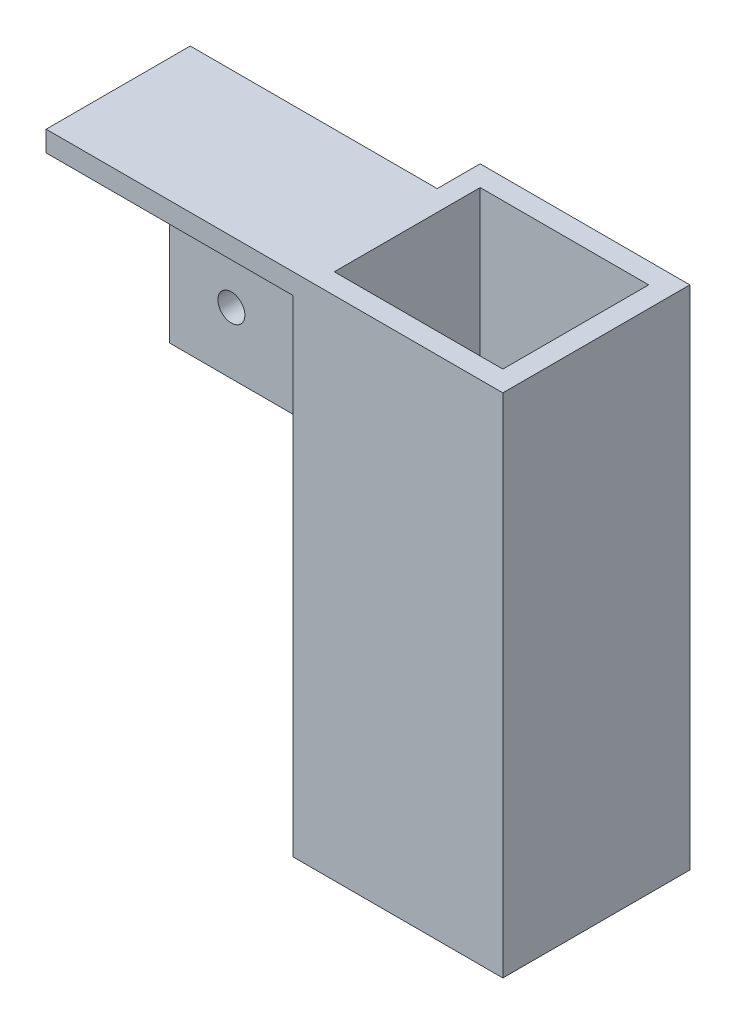
ISO-10303-21;
HEADER;
FILE_DESCRIPTION(('STEP AP214'),'2;1');
FILE_NAME('part.step','',(''),(''),'','','');
FILE_SCHEMA(('AUTOMOTIVE_DESIGN { 1 0 10303 214 1 1 1 1 }'));
ENDSEC;
DATA;
#1=APPLICATION_CONTEXT('core data for automotive mechanical design processes');
#2=APPLICATION_PROTOCOL_DEFINITION('international standard','automotive_design',2000,#1);
#3=PRODUCT_CONTEXT('',#1,'mechanical');
#4=PRODUCT('Part','Part','',(#3));
#5=PRODUCT_RELATED_PRODUCT_CATEGORY('part','',(#4));
#6=PRODUCT_DEFINITION_FORMATION('','',#4);
#7=PRODUCT_DEFINITION_CONTEXT('part definition',#1,'design');
#8=PRODUCT_DEFINITION('design','',#6,#7);
#9=PRODUCT_DEFINITION_SHAPE('','',#8);
#10=(LENGTH_UNIT() NAMED_UNIT(*) SI_UNIT(.MILLI.,.METRE.));
#11=(NAMED_UNIT(*) PLANE_ANGLE_UNIT() SI_UNIT($,.RADIAN.));
#12=(NAMED_UNIT(*) SI_UNIT($,.STERADIAN.) SOLID_ANGLE_UNIT());
#13=UNCERTAINTY_MEASURE_WITH_UNIT(LENGTH_MEASURE(1.E-05),#10,'distance_accuracy_value','');
#14=(GEOMETRIC_REPRESENTATION_CONTEXT(3) GLOBAL_UNCERTAINTY_ASSIGNED_CONTEXT((#13)) GLOBAL_UNIT_ASSIGNED_CONTEXT((#10,
#11,#12)) REPRESENTATION_CONTEXT('',''));
#15=CARTESIAN_POINT('',(0.,0.,0.));
#16=DIRECTION('',(0.,0.,1.));
#17=DIRECTION('',(1.,0.,0.));
#18=AXIS2_PLACEMENT_3D('',#15,#16,#17);
#19=CARTESIAN_POINT('',(-38.1,6.35,-19.05));
#20=DIRECTION('',(1.,0.,0.));
#21=DIRECTION('',(0.,0.,-1.));
#22=AXIS2_PLACEMENT_3D('',#19,#20,#21);
#23=PLANE('',#22);
#24=DIRECTION('',(0.,0.,1.));
#25=VECTOR('',#24,1.);
#26=CARTESIAN_POINT('',(-38.1,0.,-19.05));
#27=LINE('',#26,#25);
#28=CARTESIAN_POINT('',(-38.1,0.,-19.05));
#29=VERTEX_POINT('',#28);
#30=CARTESIAN_POINT('',(-38.1,0.,19.05));
#31=VERTEX_POINT('',#30);
#32=EDGE_CURVE('E259',#29,#31,#27,.T.);
#33=ORIENTED_EDGE('',*,*,#32,.T.);
#34=DIRECTION('',(0.,-1.,0.));
#35=VECTOR('',#34,1.);
#36=CARTESIAN_POINT('',(-38.1,6.35,19.05));
#37=LINE('',#36,#35);
#38=CARTESIAN_POINT('',(-38.1,6.35,19.05));
#39=VERTEX_POINT('',#38);
#40=EDGE_CURVE('E11',#39,#31,#37,.T.);
#41=ORIENTED_EDGE('',*,*,#40,.F.);
#42=DIRECTION('',(0.,0.,1.));
#43=VECTOR('',#42,1.);
#44=CARTESIAN_POINT('',(-38.1,6.35,-19.05));
#45=LINE('',#44,#43);
#46=CARTESIAN_POINT('',(-38.1,6.35,-25.4));
#47=VERTEX_POINT('',#46);
#48=EDGE_CURVE('E53',#47,#39,#45,.T.);
#49=ORIENTED_EDGE('',*,*,#48,.F.);
#50=DIRECTION('',(0.,1.,0.));
#51=VECTOR('',#50,1.);
#52=CARTESIAN_POINT('',(-38.1,6.35,-25.4));
#53=LINE('',#52,#51);
#54=CARTESIAN_POINT('',(-38.1,-69.85,-25.4));
#55=VERTEX_POINT('',#54);
#56=EDGE_CURVE('E229',#55,#47,#53,.T.);
#57=ORIENTED_EDGE('',*,*,#56,.F.);
#58=DIRECTION('',(0.,0.,1.));
#59=VECTOR('',#58,1.);
#60=CARTESIAN_POINT('',(-38.1,-69.85,-25.4));
#61=LINE('',#60,#59);
#62=CARTESIAN_POINT('',(-38.1,-69.85,-19.05));
#63=VERTEX_POINT('',#62);
#64=EDGE_CURVE('E241',#55,#63,#61,.T.);
#65=ORIENTED_EDGE('',*,*,#64,.T.);
#66=DIRECTION('',(0.,1.,0.));
#67=VECTOR('',#66,1.);
#68=CARTESIAN_POINT('',(-38.1,6.35,-19.05));
#69=LINE('',#68,#67);
#70=EDGE_CURVE('E226',#63,#29,#69,.T.);
#71=ORIENTED_EDGE('',*,*,#70,.T.);
#72=EDGE_LOOP('',(#33,#41,#49,#57,#65,#71));
#73=FACE_BOUND('',#72,.T.);
#74=ADVANCED_FACE('F39',(#73),#23,.F.);
#75=CARTESIAN_POINT('',(-38.1,6.35,19.05));
#76=DIRECTION('',(0.,0.,-1.));
#77=DIRECTION('',(-1.,0.,0.));
#78=AXIS2_PLACEMENT_3D('',#75,#76,#77);
#79=PLANE('',#78);
#80=DIRECTION('',(1.,0.,0.));
#81=VECTOR('',#80,1.);
#82=CARTESIAN_POINT('',(-38.1,0.,19.05));
#83=LINE('',#82,#81);
#84=CARTESIAN_POINT('',(38.1,0.,19.05));
#85=VERTEX_POINT('',#84);
#86=EDGE_CURVE('E136',#31,#85,#83,.T.);
#87=ORIENTED_EDGE('',*,*,#86,.T.);
#88=DIRECTION('',(0.,1.,0.));
#89=VECTOR('',#88,1.);
#90=CARTESIAN_POINT('',(38.1,-143.65,19.05));
#91=LINE('',#90,#89);
#92=CARTESIAN_POINT('',(38.1,-150.,19.05));
#93=VERTEX_POINT('',#92);
#94=EDGE_CURVE('E129',#93,#85,#91,.T.);
#95=ORIENTED_EDGE('',*,*,#94,.F.);
#96=DIRECTION('',(-1.,0.,0.));
#97=VECTOR('',#96,1.);
#98=CARTESIAN_POINT('',(102.8,-150.,19.05));
#99=LINE('',#98,#97);
#100=CARTESIAN_POINT('',(102.8,-150.,19.05));
#101=VERTEX_POINT('',#100);
#102=EDGE_CURVE('E134',#101,#93,#99,.T.);
#103=ORIENTED_EDGE('',*,*,#102,.F.);
#104=DIRECTION('',(0.,1.,0.));
#105=VECTOR('',#104,1.);
#106=CARTESIAN_POINT('',(102.8,-143.65,19.05));
#107=LINE('',#106,#105);
#108=CARTESIAN_POINT('',(102.8,6.35,19.05));
#109=VERTEX_POINT('',#108);
#110=EDGE_CURVE('E139',#101,#109,#107,.T.);
#111=ORIENTED_EDGE('',*,*,#110,.T.);
#112=DIRECTION('',(1.,0.,0.));
#113=VECTOR('',#112,1.);
#114=CARTESIAN_POINT('',(-38.1,6.35,19.05));
#115=LINE('',#114,#113);
#116=EDGE_CURVE('E47',#39,#109,#115,.T.);
#117=ORIENTED_EDGE('',*,*,#116,.F.);
#118=ORIENTED_EDGE('',*,*,#40,.T.);
#119=EDGE_LOOP('',(#87,#95,#103,#111,#117,#118));
#120=FACE_BOUND('',#119,.T.);
#121=ADVANCED_FACE('F131',(#120),#79,.F.);
#122=CARTESIAN_POINT('',(0.,6.35,0.));
#123=DIRECTION('',(0.,1.,0.));
#124=DIRECTION('',(0.,0.,1.));
#125=AXIS2_PLACEMENT_3D('',#122,#123,#124);
#126=PLANE('',#125);
#127=ORIENTED_EDGE('',*,*,#116,.T.);
#128=DIRECTION('',(0.,0.,-1.));
#129=VECTOR('',#128,1.);
#130=CARTESIAN_POINT('',(102.8,6.35,19.05));
#131=LINE('',#130,#129);
#132=CARTESIAN_POINT('',(102.8,6.35,-38.65));
#133=VERTEX_POINT('',#132);
#134=EDGE_CURVE('E195',#109,#133,#131,.T.);
#135=ORIENTED_EDGE('',*,*,#134,.T.);
#136=DIRECTION('',(-1.,0.,0.));
#137=VECTOR('',#136,1.);
#138=CARTESIAN_POINT('',(38.1,6.35,-38.65));
#139=LINE('',#138,#137);
#140=CARTESIAN_POINT('',(38.1,6.35,-38.65));
#141=VERTEX_POINT('',#140);
#142=EDGE_CURVE('E140',#133,#141,#139,.T.);
#143=ORIENTED_EDGE('',*,*,#142,.T.);
#144=DIRECTION('',(0.,0.,1.));
#145=VECTOR('',#144,1.);
#146=CARTESIAN_POINT('',(38.1,6.35,19.05));
#147=LINE('',#146,#145);
#148=CARTESIAN_POINT('',(38.1,6.35,-25.4));
#149=VERTEX_POINT('',#148);
#150=EDGE_CURVE('E186',#141,#149,#147,.T.);
#151=ORIENTED_EDGE('',*,*,#150,.T.);
#152=DIRECTION('',(1.,0.,0.));
#153=VECTOR('',#152,1.);
#154=CARTESIAN_POINT('',(-38.1,6.35,-25.4));
#155=LINE('',#154,#153);
#156=EDGE_CURVE('E232',#47,#149,#155,.T.);
#157=ORIENTED_EDGE('',*,*,#156,.F.);
#158=ORIENTED_EDGE('',*,*,#48,.T.);
#159=EDGE_LOOP('',(#127,#135,#143,#151,#157,#158));
#160=FACE_BOUND('',#159,.T.);
#161=DIRECTION('',(0.,0.,-1.));
#162=VECTOR('',#161,1.);
#163=CARTESIAN_POINT('',(96.45,6.35,12.7));
#164=LINE('',#163,#162);
#165=CARTESIAN_POINT('',(96.45,6.35,12.7));
#166=VERTEX_POINT('',#165);
#167=CARTESIAN_POINT('',(96.45,6.35,-32.3));
#168=VERTEX_POINT('',#167);
#169=EDGE_CURVE('E176',#166,#168,#164,.T.);
#170=ORIENTED_EDGE('',*,*,#169,.F.);
#171=DIRECTION('',(1.,0.,0.));
#172=VECTOR('',#171,1.);
#173=CARTESIAN_POINT('',(44.45,6.35,12.7));
#174=LINE('',#173,#172);
#175=CARTESIAN_POINT('',(44.45,6.35,12.7));
#176=VERTEX_POINT('',#175);
#177=EDGE_CURVE('E160',#176,#166,#174,.T.);
#178=ORIENTED_EDGE('',*,*,#177,.F.);
#179=DIRECTION('',(0.,0.,1.));
#180=VECTOR('',#179,1.);
#181=CARTESIAN_POINT('',(44.45,6.35,12.7));
#182=LINE('',#181,#180);
#183=CARTESIAN_POINT('',(44.45,6.35,-32.3));
#184=VERTEX_POINT('',#183);
#185=EDGE_CURVE('E165',#184,#176,#182,.T.);
#186=ORIENTED_EDGE('',*,*,#185,.F.);
#187=DIRECTION('',(-1.,0.,0.));
#188=VECTOR('',#187,1.);
#189=CARTESIAN_POINT('',(44.45,6.35,-32.3));
#190=LINE('',#189,#188);
#191=EDGE_CURVE('E179',#168,#184,#190,.T.);
#192=ORIENTED_EDGE('',*,*,#191,.F.);
#193=EDGE_LOOP('',(#170,#178,#186,#192));
#194=FACE_BOUND('',#193,.T.);
#195=ADVANCED_FACE('F303',(#160,#194),#126,.T.);
#196=CARTESIAN_POINT('',(0.,0.,0.));
#197=DIRECTION('',(0.,1.,0.));
#198=DIRECTION('',(0.,0.,1.));
#199=AXIS2_PLACEMENT_3D('',#196,#197,#198);
#200=PLANE('',#199);
#201=DIRECTION('',(0.,0.,-1.));
#202=VECTOR('',#201,1.);
#203=CARTESIAN_POINT('',(38.1,0.,-19.05));
#204=LINE('',#203,#202);
#205=CARTESIAN_POINT('',(38.1,0.,-19.05));
#206=VERTEX_POINT('',#205);
#207=EDGE_CURVE('E252',#85,#206,#204,.T.);
#208=ORIENTED_EDGE('',*,*,#207,.F.);
#209=ORIENTED_EDGE('',*,*,#86,.F.);
#210=ORIENTED_EDGE('',*,*,#32,.F.);
#211=DIRECTION('',(-1.,0.,0.));
#212=VECTOR('',#211,1.);
#213=CARTESIAN_POINT('',(-38.1,0.,-19.05));
#214=LINE('',#213,#212);
#215=EDGE_CURVE('E256',#206,#29,#214,.T.);
#216=ORIENTED_EDGE('',*,*,#215,.F.);
#217=EDGE_LOOP('',(#208,#209,#210,#216));
#218=FACE_BOUND('',#217,.T.);
#219=ADVANCED_FACE('F265',(#218),#200,.F.);
#220=CARTESIAN_POINT('',(0.,0.,-25.4));
#221=DIRECTION('',(0.,0.,1.));
#222=DIRECTION('',(1.,0.,0.));
#223=AXIS2_PLACEMENT_3D('',#220,#221,#222);
#224=PLANE('',#223);
#225=ORIENTED_EDGE('',*,*,#56,.T.);
#226=ORIENTED_EDGE('',*,*,#156,.T.);
#227=DIRECTION('',(0.,-1.,0.));
#228=VECTOR('',#227,1.);
#229=CARTESIAN_POINT('',(38.1,6.34999999999999,-25.4));
#230=LINE('',#229,#228);
#231=CARTESIAN_POINT('',(38.1,-69.85,-25.4));
#232=VERTEX_POINT('',#231);
#233=EDGE_CURVE('E236',#149,#232,#230,.T.);
#234=ORIENTED_EDGE('',*,*,#233,.T.);
#235=DIRECTION('',(-1.,0.,0.));
#236=VECTOR('',#235,1.);
#237=CARTESIAN_POINT('',(-38.1,-69.85,-25.4));
#238=LINE('',#237,#236);
#239=EDGE_CURVE('E239',#232,#55,#238,.T.);
#240=ORIENTED_EDGE('',*,*,#239,.T.);
#241=EDGE_LOOP('',(#225,#226,#234,#240));
#242=FACE_BOUND('',#241,.T.);
#243=CARTESIAN_POINT('',(-19.05,-12.7,-25.4));
#244=DIRECTION('',(0.,0.,-1.));
#245=DIRECTION('',(-1.,0.,0.));
#246=AXIS2_PLACEMENT_3D('',#243,#244,#245);
#247=CIRCLE('',#246,4.1656);
#248=CARTESIAN_POINT('',(-23.2156,-12.7,-25.4));
#249=VERTEX_POINT('',#248);
#250=EDGE_CURVE('E223',#249,#249,#247,.T.);
#251=ORIENTED_EDGE('',*,*,#250,.F.);
#252=EDGE_LOOP('',(#251));
#253=FACE_BOUND('',#252,.T.);
#254=CARTESIAN_POINT('',(19.05,-12.7,-25.4));
#255=DIRECTION('',(0.,0.,-1.));
#256=DIRECTION('',(-1.,0.,0.));
#257=AXIS2_PLACEMENT_3D('',#254,#255,#256);
#258=CIRCLE('',#257,4.1656);
#259=CARTESIAN_POINT('',(14.8844,-12.7,-25.4));
#260=VERTEX_POINT('',#259);
#261=EDGE_CURVE('E217',#260,#260,#258,.T.);
#262=ORIENTED_EDGE('',*,*,#261,.F.);
#263=EDGE_LOOP('',(#262));
#264=FACE_BOUND('',#263,.T.);
#265=CARTESIAN_POINT('',(-19.05,-50.8,-25.4));
#266=DIRECTION('',(0.,0.,-1.));
#267=DIRECTION('',(-1.,0.,0.));
#268=AXIS2_PLACEMENT_3D('',#265,#266,#267);
#269=CIRCLE('',#268,4.1656);
#270=CARTESIAN_POINT('',(-23.2156,-50.8,-25.4));
#271=VERTEX_POINT('',#270);
#272=EDGE_CURVE('E211',#271,#271,#269,.T.);
#273=ORIENTED_EDGE('',*,*,#272,.F.);
#274=EDGE_LOOP('',(#273));
#275=FACE_BOUND('',#274,.T.);
#276=CARTESIAN_POINT('',(19.05,-50.8,-25.4));
#277=DIRECTION('',(0.,0.,-1.));
#278=DIRECTION('',(-1.,0.,0.));
#279=AXIS2_PLACEMENT_3D('',#276,#277,#278);
#280=CIRCLE('',#279,4.1656);
#281=CARTESIAN_POINT('',(14.8844,-50.8,-25.4));
#282=VERTEX_POINT('',#281);
#283=EDGE_CURVE('E205',#282,#282,#280,.T.);
#284=ORIENTED_EDGE('',*,*,#283,.F.);
#285=EDGE_LOOP('',(#284));
#286=FACE_BOUND('',#285,.T.);
#287=ADVANCED_FACE('F276',(#242,#253,#264,#275,#286),#224,.F.);
#288=CARTESIAN_POINT('',(0.,0.,-19.05));
#289=DIRECTION('',(0.,0.,1.));
#290=DIRECTION('',(1.,0.,0.));
#291=AXIS2_PLACEMENT_3D('',#288,#289,#290);
#292=PLANE('',#291);
#293=CARTESIAN_POINT('',(-19.05,-50.8,-19.05));
#294=DIRECTION('',(0.,0.,-1.));
#295=DIRECTION('',(-1.,0.,0.));
#296=AXIS2_PLACEMENT_3D('',#293,#294,#295);
#297=CIRCLE('',#296,4.1656);
#298=CARTESIAN_POINT('',(-23.2156,-50.8,-19.05));
#299=VERTEX_POINT('',#298);
#300=EDGE_CURVE('E208',#299,#299,#297,.T.);
#301=ORIENTED_EDGE('',*,*,#300,.T.);
#302=EDGE_LOOP('',(#301));
#303=FACE_BOUND('',#302,.T.);
#304=CARTESIAN_POINT('',(-19.05,-12.7,-19.05));
#305=DIRECTION('',(0.,0.,-1.));
#306=DIRECTION('',(-1.,0.,0.));
#307=AXIS2_PLACEMENT_3D('',#304,#305,#306);
#308=CIRCLE('',#307,4.1656);
#309=CARTESIAN_POINT('',(-23.2156,-12.7,-19.05));
#310=VERTEX_POINT('',#309);
#311=EDGE_CURVE('E220',#310,#310,#308,.T.);
#312=ORIENTED_EDGE('',*,*,#311,.T.);
#313=EDGE_LOOP('',(#312));
#314=FACE_BOUND('',#313,.T.);
#315=DIRECTION('',(0.,-1.,0.));
#316=VECTOR('',#315,1.);
#317=CARTESIAN_POINT('',(38.1,6.34999999999999,-19.05));
#318=LINE('',#317,#316);
#319=CARTESIAN_POINT('',(38.1,-69.85,-19.05));
#320=VERTEX_POINT('',#319);
#321=EDGE_CURVE('E244',#206,#320,#318,.T.);
#322=ORIENTED_EDGE('',*,*,#321,.F.);
#323=ORIENTED_EDGE('',*,*,#215,.T.);
#324=ORIENTED_EDGE('',*,*,#70,.F.);
#325=DIRECTION('',(-1.,0.,0.));
#326=VECTOR('',#325,1.);
#327=CARTESIAN_POINT('',(-38.1,-69.85,-19.05));
#328=LINE('',#327,#326);
#329=EDGE_CURVE('E233',#320,#63,#328,.T.);
#330=ORIENTED_EDGE('',*,*,#329,.F.);
#331=EDGE_LOOP('',(#322,#323,#324,#330));
#332=FACE_BOUND('',#331,.T.);
#333=CARTESIAN_POINT('',(19.05,-12.7,-19.05));
#334=DIRECTION('',(0.,0.,-1.));
#335=DIRECTION('',(-1.,0.,0.));
#336=AXIS2_PLACEMENT_3D('',#333,#334,#335);
#337=CIRCLE('',#336,4.1656);
#338=CARTESIAN_POINT('',(14.8844,-12.7,-19.05));
#339=VERTEX_POINT('',#338);
#340=EDGE_CURVE('E214',#339,#339,#337,.T.);
#341=ORIENTED_EDGE('',*,*,#340,.T.);
#342=EDGE_LOOP('',(#341));
#343=FACE_BOUND('',#342,.T.);
#344=CARTESIAN_POINT('',(19.05,-50.8,-19.05));
#345=DIRECTION('',(0.,0.,-1.));
#346=DIRECTION('',(-1.,0.,0.));
#347=AXIS2_PLACEMENT_3D('',#344,#345,#346);
#348=CIRCLE('',#347,4.1656);
#349=CARTESIAN_POINT('',(14.8844,-50.8,-19.05));
#350=VERTEX_POINT('',#349);
#351=EDGE_CURVE('E201',#350,#350,#348,.T.);
#352=ORIENTED_EDGE('',*,*,#351,.T.);
#353=EDGE_LOOP('',(#352));
#354=FACE_BOUND('',#353,.T.);
#355=ADVANCED_FACE('F273',(#303,#314,#332,#343,#354),#292,.T.);
#356=CARTESIAN_POINT('',(-38.1,-69.85,-25.4));
#357=DIRECTION('',(0.,1.,0.));
#358=DIRECTION('',(-1.,0.,0.));
#359=AXIS2_PLACEMENT_3D('',#356,#357,#358);
#360=PLANE('',#359);
#361=ORIENTED_EDGE('',*,*,#329,.T.);
#362=ORIENTED_EDGE('',*,*,#64,.F.);
#363=ORIENTED_EDGE('',*,*,#239,.F.);
#364=DIRECTION('',(0.,0.,1.));
#365=VECTOR('',#364,1.);
#366=CARTESIAN_POINT('',(38.1,-69.85,-25.4));
#367=LINE('',#366,#365);
#368=EDGE_CURVE('E249',#232,#320,#367,.T.);
#369=ORIENTED_EDGE('',*,*,#368,.T.);
#370=EDGE_LOOP('',(#361,#362,#363,#369));
#371=FACE_BOUND('',#370,.T.);
#372=ADVANCED_FACE('F271',(#371),#360,.F.);
#373=CARTESIAN_POINT('',(-19.05,-12.7,-25.4));
#374=DIRECTION('',(0.,0.,1.));
#375=DIRECTION('',(1.,0.,0.));
#376=AXIS2_PLACEMENT_3D('',#373,#374,#375);
#377=CYLINDRICAL_SURFACE('',#376,4.1656);
#378=ORIENTED_EDGE('',*,*,#250,.T.);
#379=EDGE_LOOP('',(#378));
#380=FACE_BOUND('',#379,.T.);
#381=ORIENTED_EDGE('',*,*,#311,.F.);
#382=EDGE_LOOP('',(#381));
#383=FACE_BOUND('',#382,.T.);
#384=ADVANCED_FACE('F311',(#380,#383),#377,.F.);
#385=CARTESIAN_POINT('',(19.05,-12.7,-25.4));
#386=DIRECTION('',(0.,0.,1.));
#387=DIRECTION('',(1.,0.,0.));
#388=AXIS2_PLACEMENT_3D('',#385,#386,#387);
#389=CYLINDRICAL_SURFACE('',#388,4.1656);
#390=ORIENTED_EDGE('',*,*,#261,.T.);
#391=EDGE_LOOP('',(#390));
#392=FACE_BOUND('',#391,.T.);
#393=ORIENTED_EDGE('',*,*,#340,.F.);
#394=EDGE_LOOP('',(#393));
#395=FACE_BOUND('',#394,.T.);
#396=ADVANCED_FACE('F295',(#392,#395),#389,.F.);
#397=CARTESIAN_POINT('',(-19.05,-50.8,-25.4));
#398=DIRECTION('',(0.,0.,1.));
#399=DIRECTION('',(1.,0.,0.));
#400=AXIS2_PLACEMENT_3D('',#397,#398,#399);
#401=CYLINDRICAL_SURFACE('',#400,4.1656);
#402=ORIENTED_EDGE('',*,*,#272,.T.);
#403=EDGE_LOOP('',(#402));
#404=FACE_BOUND('',#403,.T.);
#405=ORIENTED_EDGE('',*,*,#300,.F.);
#406=EDGE_LOOP('',(#405));
#407=FACE_BOUND('',#406,.T.);
#408=ADVANCED_FACE('F285',(#404,#407),#401,.F.);
#409=CARTESIAN_POINT('',(19.05,-50.8,-25.4));
#410=DIRECTION('',(0.,0.,1.));
#411=DIRECTION('',(1.,0.,0.));
#412=AXIS2_PLACEMENT_3D('',#409,#410,#411);
#413=CYLINDRICAL_SURFACE('',#412,4.1656);
#414=ORIENTED_EDGE('',*,*,#283,.T.);
#415=EDGE_LOOP('',(#414));
#416=FACE_BOUND('',#415,.T.);
#417=ORIENTED_EDGE('',*,*,#351,.F.);
#418=EDGE_LOOP('',(#417));
#419=FACE_BOUND('',#418,.T.);
#420=ADVANCED_FACE('F283',(#416,#419),#413,.F.);
#421=CARTESIAN_POINT('',(38.1,-143.65,19.05));
#422=DIRECTION('',(-1.,0.,0.));
#423=DIRECTION('',(0.,0.,1.));
#424=AXIS2_PLACEMENT_3D('',#421,#422,#423);
#425=PLANE('',#424);
#426=ORIENTED_EDGE('',*,*,#94,.T.);
#427=ORIENTED_EDGE('',*,*,#207,.T.);
#428=ORIENTED_EDGE('',*,*,#321,.T.);
#429=ORIENTED_EDGE('',*,*,#368,.F.);
#430=ORIENTED_EDGE('',*,*,#233,.F.);
#431=ORIENTED_EDGE('',*,*,#150,.F.);
#432=DIRECTION('',(0.,1.,0.));
#433=VECTOR('',#432,1.);
#434=CARTESIAN_POINT('',(38.1,-143.65,-38.65));
#435=LINE('',#434,#433);
#436=CARTESIAN_POINT('',(38.1,-150.,-38.65));
#437=VERTEX_POINT('',#436);
#438=EDGE_CURVE('E146',#437,#141,#435,.T.);
#439=ORIENTED_EDGE('',*,*,#438,.F.);
#440=DIRECTION('',(0.,0.,-1.));
#441=VECTOR('',#440,1.);
#442=CARTESIAN_POINT('',(38.1,-150.,19.05));
#443=LINE('',#442,#441);
#444=EDGE_CURVE('E143',#93,#437,#443,.T.);
#445=ORIENTED_EDGE('',*,*,#444,.F.);
#446=EDGE_LOOP('',(#426,#427,#428,#429,#430,#431,#439,#445));
#447=FACE_BOUND('',#446,.T.);
#448=ADVANCED_FACE('F144',(#447),#425,.T.);
#449=CARTESIAN_POINT('',(38.1,-143.65,-38.65));
#450=DIRECTION('',(0.,0.,-1.));
#451=DIRECTION('',(-1.,0.,0.));
#452=AXIS2_PLACEMENT_3D('',#449,#450,#451);
#453=PLANE('',#452);
#454=ORIENTED_EDGE('',*,*,#142,.F.);
#455=DIRECTION('',(0.,1.,0.));
#456=VECTOR('',#455,1.);
#457=CARTESIAN_POINT('',(102.8,-143.65,-38.65));
#458=LINE('',#457,#456);
#459=CARTESIAN_POINT('',(102.8,-150.,-38.65));
#460=VERTEX_POINT('',#459);
#461=EDGE_CURVE('E202',#460,#133,#458,.T.);
#462=ORIENTED_EDGE('',*,*,#461,.F.);
#463=DIRECTION('',(1.,0.,0.));
#464=VECTOR('',#463,1.);
#465=CARTESIAN_POINT('',(38.1,-150.,-38.65));
#466=LINE('',#465,#464);
#467=EDGE_CURVE('E150',#437,#460,#466,.T.);
#468=ORIENTED_EDGE('',*,*,#467,.F.);
#469=ORIENTED_EDGE('',*,*,#438,.T.);
#470=EDGE_LOOP('',(#454,#462,#468,#469));
#471=FACE_BOUND('',#470,.T.);
#472=ADVANCED_FACE('F293',(#471),#453,.T.);
#473=CARTESIAN_POINT('',(102.8,-143.65,19.05));
#474=DIRECTION('',(1.,0.,0.));
#475=DIRECTION('',(0.,0.,-1.));
#476=AXIS2_PLACEMENT_3D('',#473,#474,#475);
#477=PLANE('',#476);
#478=ORIENTED_EDGE('',*,*,#134,.F.);
#479=ORIENTED_EDGE('',*,*,#110,.F.);
#480=DIRECTION('',(0.,0.,1.));
#481=VECTOR('',#480,1.);
#482=CARTESIAN_POINT('',(102.8,-150.,-38.65));
#483=LINE('',#482,#481);
#484=EDGE_CURVE('E155',#460,#101,#483,.T.);
#485=ORIENTED_EDGE('',*,*,#484,.F.);
#486=ORIENTED_EDGE('',*,*,#461,.T.);
#487=EDGE_LOOP('',(#478,#479,#485,#486));
#488=FACE_BOUND('',#487,.T.);
#489=ADVANCED_FACE('F384',(#488),#477,.T.);
#490=CARTESIAN_POINT('',(44.45,-143.65,12.7));
#491=DIRECTION('',(0.,0.,1.));
#492=DIRECTION('',(1.,0.,0.));
#493=AXIS2_PLACEMENT_3D('',#490,#491,#492);
#494=PLANE('',#493);
#495=ORIENTED_EDGE('',*,*,#177,.T.);
#496=DIRECTION('',(0.,1.,0.));
#497=VECTOR('',#496,1.);
#498=CARTESIAN_POINT('',(96.45,-143.65,12.7));
#499=LINE('',#498,#497);
#500=CARTESIAN_POINT('',(96.45,-143.65,12.7));
#501=VERTEX_POINT('',#500);
#502=EDGE_CURVE('E174',#501,#166,#499,.T.);
#503=ORIENTED_EDGE('',*,*,#502,.F.);
#504=DIRECTION('',(1.,0.,0.));
#505=VECTOR('',#504,1.);
#506=CARTESIAN_POINT('',(44.45,-143.65,12.7));
#507=LINE('',#506,#505);
#508=CARTESIAN_POINT('',(44.45,-143.65,12.7));
#509=VERTEX_POINT('',#508);
#510=EDGE_CURVE('E161',#509,#501,#507,.T.);
#511=ORIENTED_EDGE('',*,*,#510,.F.);
#512=DIRECTION('',(0.,1.,0.));
#513=VECTOR('',#512,1.);
#514=CARTESIAN_POINT('',(44.45,-143.65,12.7));
#515=LINE('',#514,#513);
#516=EDGE_CURVE('E184',#509,#176,#515,.T.);
#517=ORIENTED_EDGE('',*,*,#516,.T.);
#518=EDGE_LOOP('',(#495,#503,#511,#517));
#519=FACE_BOUND('',#518,.T.);
#520=ADVANCED_FACE('F396',(#519),#494,.F.);
#521=CARTESIAN_POINT('',(44.45,-143.65,12.7));
#522=DIRECTION('',(-1.,0.,0.));
#523=DIRECTION('',(0.,0.,1.));
#524=AXIS2_PLACEMENT_3D('',#521,#522,#523);
#525=PLANE('',#524);
#526=ORIENTED_EDGE('',*,*,#185,.T.);
#527=ORIENTED_EDGE('',*,*,#516,.F.);
#528=DIRECTION('',(0.,0.,1.));
#529=VECTOR('',#528,1.);
#530=CARTESIAN_POINT('',(44.45,-143.65,12.7));
#531=LINE('',#530,#529);
#532=CARTESIAN_POINT('',(44.45,-143.65,-32.3));
#533=VERTEX_POINT('',#532);
#534=EDGE_CURVE('E171',#533,#509,#531,.T.);
#535=ORIENTED_EDGE('',*,*,#534,.F.);
#536=DIRECTION('',(0.,1.,0.));
#537=VECTOR('',#536,1.);
#538=CARTESIAN_POINT('',(44.45,-143.65,-32.3));
#539=LINE('',#538,#537);
#540=EDGE_CURVE('E187',#533,#184,#539,.T.);
#541=ORIENTED_EDGE('',*,*,#540,.T.);
#542=EDGE_LOOP('',(#526,#527,#535,#541));
#543=FACE_BOUND('',#542,.T.);
#544=ADVANCED_FACE('F408',(#543),#525,.F.);
#545=CARTESIAN_POINT('',(44.45,-143.65,-32.3));
#546=DIRECTION('',(0.,0.,-1.));
#547=DIRECTION('',(-1.,0.,0.));
#548=AXIS2_PLACEMENT_3D('',#545,#546,#547);
#549=PLANE('',#548);
#550=ORIENTED_EDGE('',*,*,#191,.T.);
#551=ORIENTED_EDGE('',*,*,#540,.F.);
#552=DIRECTION('',(-1.,0.,0.));
#553=VECTOR('',#552,1.);
#554=CARTESIAN_POINT('',(44.45,-143.65,-32.3));
#555=LINE('',#554,#553);
#556=CARTESIAN_POINT('',(96.45,-143.65,-32.3));
#557=VERTEX_POINT('',#556);
#558=EDGE_CURVE('E168',#557,#533,#555,.T.);
#559=ORIENTED_EDGE('',*,*,#558,.F.);
#560=DIRECTION('',(0.,1.,0.));
#561=VECTOR('',#560,1.);
#562=CARTESIAN_POINT('',(96.45,-143.65,-32.3));
#563=LINE('',#562,#561);
#564=EDGE_CURVE('E189',#557,#168,#563,.T.);
#565=ORIENTED_EDGE('',*,*,#564,.T.);
#566=EDGE_LOOP('',(#550,#551,#559,#565));
#567=FACE_BOUND('',#566,.T.);
#568=ADVANCED_FACE('F418',(#567),#549,.F.);
#569=CARTESIAN_POINT('',(96.45,-143.65,12.7));
#570=DIRECTION('',(1.,0.,0.));
#571=DIRECTION('',(0.,0.,-1.));
#572=AXIS2_PLACEMENT_3D('',#569,#570,#571);
#573=PLANE('',#572);
#574=ORIENTED_EDGE('',*,*,#169,.T.);
#575=ORIENTED_EDGE('',*,*,#564,.F.);
#576=DIRECTION('',(0.,0.,-1.));
#577=VECTOR('',#576,1.);
#578=CARTESIAN_POINT('',(96.45,-143.65,12.7));
#579=LINE('',#578,#577);
#580=EDGE_CURVE('E164',#501,#557,#579,.T.);
#581=ORIENTED_EDGE('',*,*,#580,.F.);
#582=ORIENTED_EDGE('',*,*,#502,.T.);
#583=EDGE_LOOP('',(#574,#575,#581,#582));
#584=FACE_BOUND('',#583,.T.);
#585=ADVANCED_FACE('F427',(#584),#573,.F.);
#586=CARTESIAN_POINT('',(0.,-143.65,0.));
#587=DIRECTION('',(0.,-1.,0.));
#588=DIRECTION('',(0.,0.,-1.));
#589=AXIS2_PLACEMENT_3D('',#586,#587,#588);
#590=PLANE('',#589);
#591=ORIENTED_EDGE('',*,*,#534,.T.);
#592=ORIENTED_EDGE('',*,*,#510,.T.);
#593=ORIENTED_EDGE('',*,*,#580,.T.);
#594=ORIENTED_EDGE('',*,*,#558,.T.);
#595=EDGE_LOOP('',(#591,#592,#593,#594));
#596=FACE_BOUND('',#595,.T.);
#597=ADVANCED_FACE('F436',(#596),#590,.F.);
#598=CARTESIAN_POINT('',(0.,-150.,0.));
#599=DIRECTION('',(0.,-1.,0.));
#600=DIRECTION('',(0.,0.,-1.));
#601=AXIS2_PLACEMENT_3D('',#598,#599,#600);
#602=PLANE('',#601);
#603=ORIENTED_EDGE('',*,*,#102,.T.);
#604=ORIENTED_EDGE('',*,*,#444,.T.);
#605=ORIENTED_EDGE('',*,*,#467,.T.);
#606=ORIENTED_EDGE('',*,*,#484,.T.);
#607=EDGE_LOOP('',(#603,#604,#605,#606));
#608=FACE_BOUND('',#607,.T.);
#609=ADVANCED_FACE('F153',(#608),#602,.T.);
#610=CLOSED_SHELL('',(#74,#121,#195,#219,#287,#355,#372,#384,#396,#408,#420,#448,#472,#489,#520,
#544,#568,#585,#597,#609));
#611=MANIFOLD_SOLID_BREP('B2',#610);
#612=ADVANCED_BREP_SHAPE_REPRESENTATION('',(#18,#611),#14);
#613=SHAPE_DEFINITION_REPRESENTATION(#9,#612);
ENDSEC;
END-ISO-10303-21;
